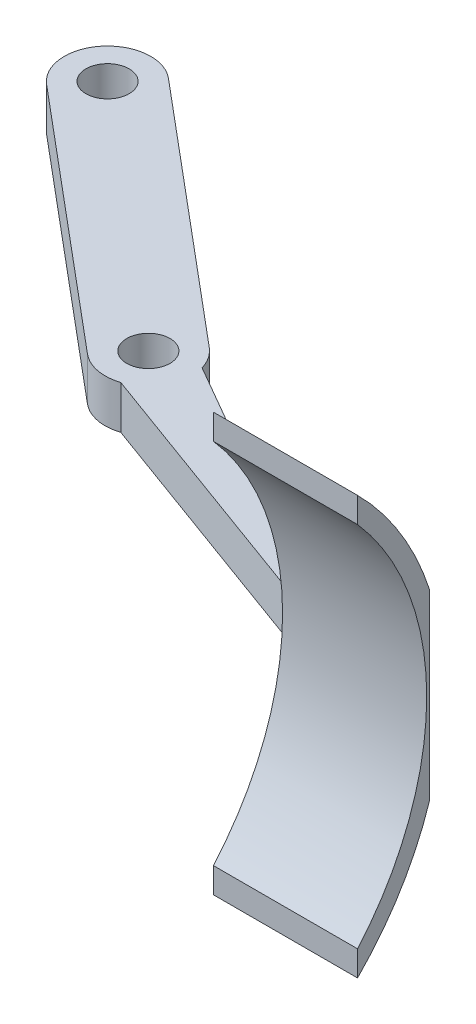
ISO-10303-21;
HEADER;
FILE_DESCRIPTION(('STEP AP214'),'2;1');
FILE_NAME('part.step','',(''),(''),'','','');
FILE_SCHEMA(('AUTOMOTIVE_DESIGN { 1 0 10303 214 1 1 1 1 }'));
ENDSEC;
DATA;
#1=APPLICATION_CONTEXT('core data for automotive mechanical design processes');
#2=APPLICATION_PROTOCOL_DEFINITION('international standard','automotive_design',2000,#1);
#3=PRODUCT_CONTEXT('',#1,'mechanical');
#4=PRODUCT('Part','Part','',(#3));
#5=PRODUCT_RELATED_PRODUCT_CATEGORY('part','',(#4));
#6=PRODUCT_DEFINITION_FORMATION('','',#4);
#7=PRODUCT_DEFINITION_CONTEXT('part definition',#1,'design');
#8=PRODUCT_DEFINITION('design','',#6,#7);
#9=PRODUCT_DEFINITION_SHAPE('','',#8);
#10=(LENGTH_UNIT() NAMED_UNIT(*) SI_UNIT(.MILLI.,.METRE.));
#11=(NAMED_UNIT(*) PLANE_ANGLE_UNIT() SI_UNIT($,.RADIAN.));
#12=(NAMED_UNIT(*) SI_UNIT($,.STERADIAN.) SOLID_ANGLE_UNIT());
#13=UNCERTAINTY_MEASURE_WITH_UNIT(LENGTH_MEASURE(1.E-05),#10,'distance_accuracy_value','');
#14=(GEOMETRIC_REPRESENTATION_CONTEXT(3) GLOBAL_UNCERTAINTY_ASSIGNED_CONTEXT((#13)) GLOBAL_UNIT_ASSIGNED_CONTEXT((#10,
#11,#12)) REPRESENTATION_CONTEXT('',''));
#15=CARTESIAN_POINT('',(0.,0.,0.));
#16=DIRECTION('',(0.,0.,1.));
#17=DIRECTION('',(1.,0.,0.));
#18=AXIS2_PLACEMENT_3D('',#15,#16,#17);
#19=CARTESIAN_POINT('',(0.,3.,0.));
#20=DIRECTION('',(0.,1.,0.));
#21=DIRECTION('',(0.,0.,1.));
#22=AXIS2_PLACEMENT_3D('',#19,#20,#21);
#23=PLANE('',#22);
#24=CARTESIAN_POINT('',(9.45858225453458,3.,-14.53916971558));
#25=DIRECTION('',(0.,1.,0.));
#26=DIRECTION('',(0.,0.,1.));
#27=AXIS2_PLACEMENT_3D('',#24,#25,#26);
#28=CIRCLE('',#27,1.5);
#29=CARTESIAN_POINT('',(9.45858225453458,3.,-13.03916971558));
#30=VERTEX_POINT('',#29);
#31=EDGE_CURVE('E331',#30,#30,#28,.T.);
#32=ORIENTED_EDGE('',*,*,#31,.F.);
#33=EDGE_LOOP('',(#32));
#34=FACE_BOUND('',#33,.T.);
#35=CARTESIAN_POINT('',(27.0776044462711,3.,0.244945307210359));
#36=DIRECTION('',(0.,1.,0.));
#37=DIRECTION('',(0.,0.,1.));
#38=AXIS2_PLACEMENT_3D('',#35,#36,#37);
#39=CIRCLE('',#38,1.5);
#40=CARTESIAN_POINT('',(27.0776044462711,3.,1.74494530721036));
#41=VERTEX_POINT('',#40);
#42=EDGE_CURVE('E340',#41,#41,#39,.T.);
#43=ORIENTED_EDGE('',*,*,#42,.F.);
#44=EDGE_LOOP('',(#43));
#45=FACE_BOUND('',#44,.T.);
#46=DIRECTION('',(0.866025403784442,0.,0.499999999999995));
#47=VECTOR('',#46,1.);
#48=CARTESIAN_POINT('',(26.5,3.,-2.59807621135332));
#49=LINE('',#48,#47);
#50=CARTESIAN_POINT('',(29.9552140227481,3.,-0.603207465211936));
#51=VERTEX_POINT('',#50);
#52=CARTESIAN_POINT('',(38.7529692626481,3.,4.47617889080871));
#53=VERTEX_POINT('',#52);
#54=EDGE_CURVE('E267',#51,#53,#49,.T.);
#55=ORIENTED_EDGE('',*,*,#54,.F.);
#56=CARTESIAN_POINT('',(27.0776044462711,3.,0.244945307210359));
#57=DIRECTION('',(0.,-1.,0.));
#58=DIRECTION('',(0.,0.,-1.));
#59=AXIS2_PLACEMENT_3D('',#56,#57,#58);
#60=CIRCLE('',#59,3.);
#61=CARTESIAN_POINT('',(29.0059672753307,3.,-2.05318802214658));
#62=VERTEX_POINT('',#61);
#63=EDGE_CURVE('E164',#62,#51,#60,.T.);
#64=ORIENTED_EDGE('',*,*,#63,.F.);
#65=DIRECTION('',(0.766044443118979,0.,0.642787609686538));
#66=VECTOR('',#65,1.);
#67=CARTESIAN_POINT('',(29.0059672753307,3.,-2.05318802214658));
#68=LINE('',#67,#66);
#69=CARTESIAN_POINT('',(11.3869450835942,3.,-16.8373030449369));
#70=VERTEX_POINT('',#69);
#71=EDGE_CURVE('E174',#70,#62,#68,.T.);
#72=ORIENTED_EDGE('',*,*,#71,.F.);
#73=CARTESIAN_POINT('',(9.45858225453458,3.,-14.53916971558));
#74=DIRECTION('',(0.,-1.,0.));
#75=DIRECTION('',(0.,0.,-1.));
#76=AXIS2_PLACEMENT_3D('',#73,#74,#75);
#77=CIRCLE('',#76,3.);
#78=CARTESIAN_POINT('',(7.53021942547497,3.,-12.2410363862231));
#79=VERTEX_POINT('',#78);
#80=EDGE_CURVE('E179',#79,#70,#77,.T.);
#81=ORIENTED_EDGE('',*,*,#80,.F.);
#82=DIRECTION('',(-0.766044443118979,0.,-0.642787609686538));
#83=VECTOR('',#82,1.);
#84=CARTESIAN_POINT('',(25.1492416172115,3.,2.54307863656729));
#85=LINE('',#84,#83);
#86=CARTESIAN_POINT('',(25.1492416172115,3.,2.54307863656729));
#87=VERTEX_POINT('',#86);
#88=EDGE_CURVE('E170',#87,#79,#85,.T.);
#89=ORIENTED_EDGE('',*,*,#88,.F.);
#90=CARTESIAN_POINT('',(28.0122150685353,3.,3.09564749873281));
#91=VERTEX_POINT('',#90);
#92=EDGE_CURVE('E155',#91,#87,#60,.T.);
#93=ORIENTED_EDGE('',*,*,#92,.F.);
#94=DIRECTION('',(-0.93937230919502,0.,-0.342898913263976));
#95=VECTOR('',#94,1.);
#96=CARTESIAN_POINT('',(26.9424392113373,3.,2.70514740065821));
#97=LINE('',#96,#95);
#98=CARTESIAN_POINT('',(46.0069306376765,3.,9.66425544337241));
#99=VERTEX_POINT('',#98);
#100=EDGE_CURVE('E265',#99,#91,#97,.T.);
#101=ORIENTED_EDGE('',*,*,#100,.F.);
#102=DIRECTION('',(0.,0.,1.));
#103=VECTOR('',#102,1.);
#104=CARTESIAN_POINT('',(46.0069306376764,3.,-3.19237210539256E-13));
#105=LINE('',#104,#103);
#106=CARTESIAN_POINT('',(46.0069306376765,3.,8.71915120486591));
#107=VERTEX_POINT('',#106);
#108=EDGE_CURVE('E262',#107,#99,#105,.T.);
#109=ORIENTED_EDGE('',*,*,#108,.F.);
#110=DIRECTION('',(1.,0.,0.));
#111=VECTOR('',#110,1.);
#112=CARTESIAN_POINT('',(46.0069306376765,3.,8.71915120486591));
#113=LINE('',#112,#111);
#114=CARTESIAN_POINT('',(55.0618263991699,3.,8.71915120486585));
#115=VERTEX_POINT('',#114);
#116=EDGE_CURVE('E257',#115,#107,#113,.F.);
#117=ORIENTED_EDGE('',*,*,#116,.F.);
#118=DIRECTION('',(0.707106781186551,0.,0.707106781186544));
#119=VECTOR('',#118,1.);
#120=CARTESIAN_POINT('',(23.1713375971518,3.,-23.171337597152));
#121=LINE('',#120,#119);
#122=CARTESIAN_POINT('',(53.0069306376764,3.,6.66425544337239));
#123=VERTEX_POINT('',#122);
#124=EDGE_CURVE('E46',#115,#123,#121,.F.);
#125=ORIENTED_EDGE('',*,*,#124,.T.);
#126=DIRECTION('',(1.,0.,0.));
#127=VECTOR('',#126,1.);
#128=CARTESIAN_POINT('',(50.8483883491102,3.,6.66425544337239));
#129=LINE('',#128,#127);
#130=CARTESIAN_POINT('',(45.0722670511086,3.,6.66425544337239));
#131=VERTEX_POINT('',#130);
#132=EDGE_CURVE('E208',#131,#123,#129,.T.);
#133=ORIENTED_EDGE('',*,*,#132,.F.);
#134=DIRECTION('',(-0.944957072862003,0.,-0.327194331320203));
#135=VECTOR('',#134,1.);
#136=CARTESIAN_POINT('',(38.7529692626481,3.,4.47617889080871));
#137=LINE('',#136,#135);
#138=EDGE_CURVE('E211',#131,#53,#137,.T.);
#139=ORIENTED_EDGE('',*,*,#138,.T.);
#140=EDGE_LOOP('',(#55,#64,#72,#81,#89,#93,#101,#109,#117,#125,#133,#139));
#141=FACE_BOUND('',#140,.T.);
#142=ADVANCED_FACE('F37',(#34,#45,#141),#23,.T.);
#143=CARTESIAN_POINT('',(0.,0.,0.));
#144=DIRECTION('',(0.,1.,0.));
#145=DIRECTION('',(0.,0.,1.));
#146=AXIS2_PLACEMENT_3D('',#143,#144,#145);
#147=PLANE('',#146);
#148=CARTESIAN_POINT('',(9.45858225453458,0.,-14.53916971558));
#149=DIRECTION('',(0.,1.,0.));
#150=DIRECTION('',(0.,0.,1.));
#151=AXIS2_PLACEMENT_3D('',#148,#149,#150);
#152=CIRCLE('',#151,1.5);
#153=CARTESIAN_POINT('',(9.45858225453458,0.,-13.03916971558));
#154=VERTEX_POINT('',#153);
#155=EDGE_CURVE('E329',#154,#154,#152,.T.);
#156=ORIENTED_EDGE('',*,*,#155,.T.);
#157=EDGE_LOOP('',(#156));
#158=FACE_BOUND('',#157,.T.);
#159=CARTESIAN_POINT('',(27.0776044462711,0.,0.244945307210359));
#160=DIRECTION('',(0.,1.,0.));
#161=DIRECTION('',(0.,0.,1.));
#162=AXIS2_PLACEMENT_3D('',#159,#160,#161);
#163=CIRCLE('',#162,1.5);
#164=CARTESIAN_POINT('',(27.0776044462711,0.,1.74494530721036));
#165=VERTEX_POINT('',#164);
#166=EDGE_CURVE('E336',#165,#165,#163,.T.);
#167=ORIENTED_EDGE('',*,*,#166,.T.);
#168=EDGE_LOOP('',(#167));
#169=FACE_BOUND('',#168,.T.);
#170=DIRECTION('',(-0.93937230919502,0.,-0.342898913263976));
#171=VECTOR('',#170,1.);
#172=CARTESIAN_POINT('',(26.9424392113373,0.,2.70514740065821));
#173=LINE('',#172,#171);
#174=CARTESIAN_POINT('',(46.0069306376765,0.,9.66425544337241));
#175=VERTEX_POINT('',#174);
#176=CARTESIAN_POINT('',(28.0122150685353,0.,3.09564749873281));
#177=VERTEX_POINT('',#176);
#178=EDGE_CURVE('E264',#175,#177,#173,.T.);
#179=ORIENTED_EDGE('',*,*,#178,.T.);
#180=CARTESIAN_POINT('',(27.0776044462711,0.,0.244945307210359));
#181=DIRECTION('',(0.,-1.,0.));
#182=DIRECTION('',(0.,0.,-1.));
#183=AXIS2_PLACEMENT_3D('',#180,#181,#182);
#184=CIRCLE('',#183,3.);
#185=CARTESIAN_POINT('',(25.1492416172115,0.,2.54307863656729));
#186=VERTEX_POINT('',#185);
#187=EDGE_CURVE('E190',#177,#186,#184,.T.);
#188=ORIENTED_EDGE('',*,*,#187,.T.);
#189=DIRECTION('',(-0.766044443118979,0.,-0.642787609686538));
#190=VECTOR('',#189,1.);
#191=CARTESIAN_POINT('',(25.1492416172115,0.,2.54307863656729));
#192=LINE('',#191,#190);
#193=CARTESIAN_POINT('',(7.53021942547497,0.,-12.2410363862231));
#194=VERTEX_POINT('',#193);
#195=EDGE_CURVE('E172',#186,#194,#192,.T.);
#196=ORIENTED_EDGE('',*,*,#195,.T.);
#197=CARTESIAN_POINT('',(9.45858225453458,0.,-14.53916971558));
#198=DIRECTION('',(0.,-1.,0.));
#199=DIRECTION('',(0.,0.,-1.));
#200=AXIS2_PLACEMENT_3D('',#197,#198,#199);
#201=CIRCLE('',#200,3.);
#202=CARTESIAN_POINT('',(11.3869450835942,0.,-16.8373030449369));
#203=VERTEX_POINT('',#202);
#204=EDGE_CURVE('E192',#194,#203,#201,.T.);
#205=ORIENTED_EDGE('',*,*,#204,.T.);
#206=DIRECTION('',(0.766044443118979,0.,0.642787609686538));
#207=VECTOR('',#206,1.);
#208=CARTESIAN_POINT('',(29.0059672753307,0.,-2.05318802214658));
#209=LINE('',#208,#207);
#210=CARTESIAN_POINT('',(29.0059672753307,0.,-2.05318802214658));
#211=VERTEX_POINT('',#210);
#212=EDGE_CURVE('E165',#203,#211,#209,.T.);
#213=ORIENTED_EDGE('',*,*,#212,.T.);
#214=CARTESIAN_POINT('',(29.9552140227481,0.,-0.603207465211936));
#215=VERTEX_POINT('',#214);
#216=EDGE_CURVE('E187',#211,#215,#184,.T.);
#217=ORIENTED_EDGE('',*,*,#216,.T.);
#218=DIRECTION('',(0.866025403784442,0.,0.499999999999995));
#219=VECTOR('',#218,1.);
#220=CARTESIAN_POINT('',(26.5,0.,-2.59807621135332));
#221=LINE('',#220,#219);
#222=CARTESIAN_POINT('',(38.7529692626481,0.,4.47617889080871));
#223=VERTEX_POINT('',#222);
#224=EDGE_CURVE('E53',#215,#223,#221,.T.);
#225=ORIENTED_EDGE('',*,*,#224,.T.);
#226=DIRECTION('',(-0.944957072862003,0.,-0.327194331320203));
#227=VECTOR('',#226,1.);
#228=CARTESIAN_POINT('',(38.7529692626481,0.,4.47617889080871));
#229=LINE('',#228,#227);
#230=CARTESIAN_POINT('',(45.0722670511086,0.,6.66425544337239));
#231=VERTEX_POINT('',#230);
#232=EDGE_CURVE('E212',#231,#223,#229,.T.);
#233=ORIENTED_EDGE('',*,*,#232,.F.);
#234=DIRECTION('',(-1.,0.,0.));
#235=VECTOR('',#234,1.);
#236=CARTESIAN_POINT('',(56.0069306376765,0.,6.66425544337239));
#237=LINE('',#236,#235);
#238=CARTESIAN_POINT('',(53.0069306376764,0.,6.66425544337239));
#239=VERTEX_POINT('',#238);
#240=EDGE_CURVE('E206',#239,#231,#237,.T.);
#241=ORIENTED_EDGE('',*,*,#240,.F.);
#242=DIRECTION('',(-0.707106781186551,0.,-0.707106781186544));
#243=VECTOR('',#242,1.);
#244=CARTESIAN_POINT('',(53.0069306376764,0.,6.66425544337239));
#245=LINE('',#244,#243);
#246=CARTESIAN_POINT('',(55.0618263991699,0.,8.71915120486585));
#247=VERTEX_POINT('',#246);
#248=EDGE_CURVE('E277',#239,#247,#245,.F.);
#249=ORIENTED_EDGE('',*,*,#248,.T.);
#250=DIRECTION('',(1.,0.,0.));
#251=VECTOR('',#250,1.);
#252=CARTESIAN_POINT('',(46.0069306376765,0.,8.71915120486591));
#253=LINE('',#252,#251);
#254=CARTESIAN_POINT('',(46.0069306376765,0.,8.71915120486591));
#255=VERTEX_POINT('',#254);
#256=EDGE_CURVE('E249',#247,#255,#253,.F.);
#257=ORIENTED_EDGE('',*,*,#256,.T.);
#258=DIRECTION('',(0.,0.,1.));
#259=VECTOR('',#258,1.);
#260=CARTESIAN_POINT('',(46.0069306376764,0.,-3.19237210539256E-13));
#261=LINE('',#260,#259);
#262=EDGE_CURVE('E259',#255,#175,#261,.T.);
#263=ORIENTED_EDGE('',*,*,#262,.T.);
#264=EDGE_LOOP('',(#179,#188,#196,#205,#213,#217,#225,#233,#241,#249,#257,#263));
#265=FACE_BOUND('',#264,.T.);
#266=ADVANCED_FACE('F299',(#158,#169,#265),#147,.F.);
#267=CARTESIAN_POINT('',(26.5,3.,-2.59807621135332));
#268=DIRECTION('',(0.499999999999995,0.,-0.866025403784441));
#269=DIRECTION('',(-0.866025403784442,0.,-0.499999999999995));
#270=AXIS2_PLACEMENT_3D('',#267,#268,#269);
#271=PLANE('',#270);
#272=DIRECTION('',(0.,-1.,0.));
#273=VECTOR('',#272,1.);
#274=CARTESIAN_POINT('',(29.9552140227481,3.,-0.603207465211935));
#275=LINE('',#274,#273);
#276=EDGE_CURVE('E57',#51,#215,#275,.T.);
#277=ORIENTED_EDGE('',*,*,#276,.F.);
#278=ORIENTED_EDGE('',*,*,#54,.T.);
#279=DIRECTION('',(0.,1.,0.));
#280=VECTOR('',#279,1.);
#281=CARTESIAN_POINT('',(38.7529692626481,0.,4.47617889080871));
#282=LINE('',#281,#280);
#283=EDGE_CURVE('E215',#223,#53,#282,.T.);
#284=ORIENTED_EDGE('',*,*,#283,.F.);
#285=ORIENTED_EDGE('',*,*,#224,.F.);
#286=EDGE_LOOP('',(#277,#278,#284,#285));
#287=FACE_BOUND('',#286,.T.);
#288=ADVANCED_FACE('F353',(#287),#271,.T.);
#289=CARTESIAN_POINT('',(26.9424392113373,3.,2.70514740065821));
#290=DIRECTION('',(-0.342898913263976,0.,0.93937230919502));
#291=DIRECTION('',(0.93937230919502,0.,0.342898913263976));
#292=AXIS2_PLACEMENT_3D('',#289,#290,#291);
#293=PLANE('',#292);
#294=DIRECTION('',(0.,-1.,0.));
#295=VECTOR('',#294,1.);
#296=CARTESIAN_POINT('',(28.0122150685353,3.,3.09564749873281));
#297=LINE('',#296,#295);
#298=EDGE_CURVE('E11',#177,#91,#297,.F.);
#299=ORIENTED_EDGE('',*,*,#298,.F.);
#300=ORIENTED_EDGE('',*,*,#178,.F.);
#301=DIRECTION('',(0.,-1.,0.));
#302=VECTOR('',#301,1.);
#303=CARTESIAN_POINT('',(46.0069306376765,3.,9.66425544337241));
#304=LINE('',#303,#302);
#305=EDGE_CURVE('E269',#99,#175,#304,.T.);
#306=ORIENTED_EDGE('',*,*,#305,.F.);
#307=ORIENTED_EDGE('',*,*,#100,.T.);
#308=EDGE_LOOP('',(#299,#300,#306,#307));
#309=FACE_BOUND('',#308,.T.);
#310=ADVANCED_FACE('F327',(#309),#293,.T.);
#311=CARTESIAN_POINT('',(56.0069306376765,3.,9.66425544337239));
#312=DIRECTION('',(1.,0.,0.));
#313=DIRECTION('',(0.,0.,-1.));
#314=AXIS2_PLACEMENT_3D('',#311,#312,#313);
#315=PLANE('',#314);
#316=CARTESIAN_POINT('',(56.0069306376766,1.5,29.1850887767055));
#317=DIRECTION('',(1.,0.,0.));
#318=DIRECTION('',(0.,0.,1.));
#319=AXIS2_PLACEMENT_3D('',#316,#317,#318);
#320=CIRCLE('',#319,20.5208333333332);
#321=CARTESIAN_POINT('',(56.0069306376765,-13.,14.6642554433724));
#322=VERTEX_POINT('',#321);
#323=CARTESIAN_POINT('',(56.0069306376765,-4.82784850219008,9.66425544337239));
#324=VERTEX_POINT('',#323);
#325=EDGE_CURVE('E235',#322,#324,#320,.T.);
#326=ORIENTED_EDGE('',*,*,#325,.T.);
#327=DIRECTION('',(0.,1.,0.));
#328=VECTOR('',#327,1.);
#329=CARTESIAN_POINT('',(56.0069306376765,3.,9.66425544337239));
#330=LINE('',#329,#328);
#331=CARTESIAN_POINT('',(56.0069306376765,7.82784850219008,9.66425544337239));
#332=VERTEX_POINT('',#331);
#333=EDGE_CURVE('E281',#324,#332,#330,.T.);
#334=ORIENTED_EDGE('',*,*,#333,.T.);
#335=CARTESIAN_POINT('',(56.0069306376765,16.,14.6642554433724));
#336=VERTEX_POINT('',#335);
#337=EDGE_CURVE('E220',#332,#336,#320,.T.);
#338=ORIENTED_EDGE('',*,*,#337,.T.);
#339=DIRECTION('',(0.,-1.,0.));
#340=VECTOR('',#339,1.);
#341=CARTESIAN_POINT('',(56.0069306376765,16.,14.6642554433724));
#342=LINE('',#341,#340);
#343=CARTESIAN_POINT('',(56.0069306376765,14.2451951730839,14.6642554433724));
#344=VERTEX_POINT('',#343);
#345=EDGE_CURVE('E238',#336,#344,#342,.T.);
#346=ORIENTED_EDGE('',*,*,#345,.T.);
#347=CARTESIAN_POINT('',(56.0069306376766,1.5,29.1850887767055));
#348=DIRECTION('',(-1.,0.,0.));
#349=DIRECTION('',(0.,0.,1.));
#350=AXIS2_PLACEMENT_3D('',#347,#348,#349);
#351=CIRCLE('',#350,19.3208333333332);
#352=CARTESIAN_POINT('',(56.0069306376765,-11.2451951730839,14.6642554433724));
#353=VERTEX_POINT('',#352);
#354=EDGE_CURVE('E241',#344,#353,#351,.T.);
#355=ORIENTED_EDGE('',*,*,#354,.T.);
#356=DIRECTION('',(0.,-1.,0.));
#357=VECTOR('',#356,1.);
#358=CARTESIAN_POINT('',(56.0069306376765,-11.2451951730839,14.6642554433724));
#359=LINE('',#358,#357);
#360=EDGE_CURVE('E244',#353,#322,#359,.T.);
#361=ORIENTED_EDGE('',*,*,#360,.T.);
#362=EDGE_LOOP('',(#326,#334,#338,#346,#355,#361));
#363=FACE_BOUND('',#362,.T.);
#364=ADVANCED_FACE('F356',(#363),#315,.T.);
#365=CARTESIAN_POINT('',(46.0069306376766,1.5,29.1850887767056));
#366=DIRECTION('',(1.,0.,0.));
#367=DIRECTION('',(0.,0.,-1.));
#368=AXIS2_PLACEMENT_3D('',#365,#366,#367);
#369=CYLINDRICAL_SURFACE('',#368,20.5208333333332);
#370=ORIENTED_EDGE('',*,*,#256,.F.);
#371=CARTESIAN_POINT('',(75.5277639710096,1.5,29.1850887767053));
#372=DIRECTION('',(-0.707106781186544,0.,0.707106781186551));
#373=DIRECTION('',(0.707106781186551,0.,0.707106781186544));
#374=AXIS2_PLACEMENT_3D('',#371,#372,#373);
#375=ELLIPSE('',#374,29.0208408111976,20.5208333333332);
#376=EDGE_CURVE('E279',#247,#324,#375,.T.);
#377=ORIENTED_EDGE('',*,*,#376,.T.);
#378=ORIENTED_EDGE('',*,*,#325,.F.);
#379=DIRECTION('',(1.,0.,0.));
#380=VECTOR('',#379,1.);
#381=CARTESIAN_POINT('',(46.0069306376765,-13.,14.6642554433725));
#382=LINE('',#381,#380);
#383=CARTESIAN_POINT('',(46.0069306376765,-13.,14.6642554433725));
#384=VERTEX_POINT('',#383);
#385=EDGE_CURVE('E247',#384,#322,#382,.T.);
#386=ORIENTED_EDGE('',*,*,#385,.F.);
#387=CARTESIAN_POINT('',(46.0069306376766,1.5,29.1850887767056));
#388=DIRECTION('',(1.,0.,0.));
#389=DIRECTION('',(0.,0.,1.));
#390=AXIS2_PLACEMENT_3D('',#387,#388,#389);
#391=CIRCLE('',#390,20.5208333333332);
#392=EDGE_CURVE('E221',#384,#255,#391,.T.);
#393=ORIENTED_EDGE('',*,*,#392,.T.);
#394=EDGE_LOOP('',(#370,#377,#378,#386,#393));
#395=FACE_BOUND('',#394,.T.);
#396=ADVANCED_FACE('F303',(#395),#369,.T.);
#397=ORIENTED_EDGE('',*,*,#337,.F.);
#398=CARTESIAN_POINT('',(75.5277639710096,1.5,29.1850887767053));
#399=DIRECTION('',(-0.707106781186544,0.,0.707106781186551));
#400=DIRECTION('',(0.707106781186551,0.,0.707106781186544));
#401=AXIS2_PLACEMENT_3D('',#398,#399,#400);
#402=ELLIPSE('',#401,29.0208408111976,20.5208333333332);
#403=EDGE_CURVE('E283',#332,#115,#402,.T.);
#404=ORIENTED_EDGE('',*,*,#403,.T.);
#405=ORIENTED_EDGE('',*,*,#116,.T.);
#406=CARTESIAN_POINT('',(46.0069306376765,16.,14.6642554433725));
#407=VERTEX_POINT('',#406);
#408=EDGE_CURVE('E225',#107,#407,#391,.T.);
#409=ORIENTED_EDGE('',*,*,#408,.T.);
#410=DIRECTION('',(1.,0.,0.));
#411=VECTOR('',#410,1.);
#412=CARTESIAN_POINT('',(46.0069306376765,16.,14.6642554433725));
#413=LINE('',#412,#411);
#414=EDGE_CURVE('E234',#407,#336,#413,.T.);
#415=ORIENTED_EDGE('',*,*,#414,.T.);
#416=EDGE_LOOP('',(#397,#404,#405,#409,#415));
#417=FACE_BOUND('',#416,.T.);
#418=ADVANCED_FACE('F324',(#417),#369,.T.);
#419=CARTESIAN_POINT('',(46.0069306376765,-11.2451951730839,14.6642554433725));
#420=DIRECTION('',(0.,0.,1.));
#421=DIRECTION('',(1.,0.,0.));
#422=AXIS2_PLACEMENT_3D('',#419,#420,#421);
#423=PLANE('',#422);
#424=ORIENTED_EDGE('',*,*,#360,.F.);
#425=DIRECTION('',(1.,0.,0.));
#426=VECTOR('',#425,1.);
#427=CARTESIAN_POINT('',(46.0069306376765,-11.2451951730839,14.6642554433725));
#428=LINE('',#427,#426);
#429=CARTESIAN_POINT('',(46.0069306376765,-11.2451951730839,14.6642554433725));
#430=VERTEX_POINT('',#429);
#431=EDGE_CURVE('E250',#430,#353,#428,.T.);
#432=ORIENTED_EDGE('',*,*,#431,.F.);
#433=DIRECTION('',(0.,-1.,0.));
#434=VECTOR('',#433,1.);
#435=CARTESIAN_POINT('',(46.0069306376765,-11.2451951730839,14.6642554433725));
#436=LINE('',#435,#434);
#437=EDGE_CURVE('E231',#430,#384,#436,.T.);
#438=ORIENTED_EDGE('',*,*,#437,.T.);
#439=ORIENTED_EDGE('',*,*,#385,.T.);
#440=EDGE_LOOP('',(#424,#432,#438,#439));
#441=FACE_BOUND('',#440,.T.);
#442=ADVANCED_FACE('F313',(#441),#423,.T.);
#443=CARTESIAN_POINT('',(46.0069306376766,1.5,29.1850887767056));
#444=DIRECTION('',(1.,0.,0.));
#445=DIRECTION('',(0.,0.,-1.));
#446=AXIS2_PLACEMENT_3D('',#443,#444,#445);
#447=CYLINDRICAL_SURFACE('',#446,19.3208333333332);
#448=ORIENTED_EDGE('',*,*,#354,.F.);
#449=DIRECTION('',(1.,0.,0.));
#450=VECTOR('',#449,1.);
#451=CARTESIAN_POINT('',(46.0069306376765,14.2451951730839,14.6642554433725));
#452=LINE('',#451,#450);
#453=CARTESIAN_POINT('',(46.0069306376765,14.2451951730839,14.6642554433725));
#454=VERTEX_POINT('',#453);
#455=EDGE_CURVE('E252',#454,#344,#452,.T.);
#456=ORIENTED_EDGE('',*,*,#455,.F.);
#457=CARTESIAN_POINT('',(46.0069306376766,1.5,29.1850887767056));
#458=DIRECTION('',(-1.,0.,0.));
#459=DIRECTION('',(0.,0.,1.));
#460=AXIS2_PLACEMENT_3D('',#457,#458,#459);
#461=CIRCLE('',#460,19.3208333333332);
#462=EDGE_CURVE('E228',#454,#430,#461,.T.);
#463=ORIENTED_EDGE('',*,*,#462,.T.);
#464=ORIENTED_EDGE('',*,*,#431,.T.);
#465=EDGE_LOOP('',(#448,#456,#463,#464));
#466=FACE_BOUND('',#465,.T.);
#467=ADVANCED_FACE('F316',(#466),#447,.F.);
#468=CARTESIAN_POINT('',(46.0069306376765,16.,14.6642554433725));
#469=DIRECTION('',(0.,0.,1.));
#470=DIRECTION('',(1.,0.,0.));
#471=AXIS2_PLACEMENT_3D('',#468,#469,#470);
#472=PLANE('',#471);
#473=ORIENTED_EDGE('',*,*,#345,.F.);
#474=ORIENTED_EDGE('',*,*,#414,.F.);
#475=DIRECTION('',(0.,-1.,0.));
#476=VECTOR('',#475,1.);
#477=CARTESIAN_POINT('',(46.0069306376765,16.,14.6642554433725));
#478=LINE('',#477,#476);
#479=EDGE_CURVE('E224',#407,#454,#478,.T.);
#480=ORIENTED_EDGE('',*,*,#479,.T.);
#481=ORIENTED_EDGE('',*,*,#455,.T.);
#482=EDGE_LOOP('',(#473,#474,#480,#481));
#483=FACE_BOUND('',#482,.T.);
#484=ADVANCED_FACE('F321',(#483),#472,.T.);
#485=CARTESIAN_POINT('',(46.0069306376766,1.5,29.1850887767056));
#486=DIRECTION('',(-1.,0.,0.));
#487=DIRECTION('',(0.,0.,1.));
#488=AXIS2_PLACEMENT_3D('',#485,#486,#487);
#489=PLANE('',#488);
#490=ORIENTED_EDGE('',*,*,#408,.F.);
#491=ORIENTED_EDGE('',*,*,#108,.T.);
#492=ORIENTED_EDGE('',*,*,#305,.T.);
#493=ORIENTED_EDGE('',*,*,#262,.F.);
#494=ORIENTED_EDGE('',*,*,#392,.F.);
#495=ORIENTED_EDGE('',*,*,#437,.F.);
#496=ORIENTED_EDGE('',*,*,#462,.F.);
#497=ORIENTED_EDGE('',*,*,#479,.F.);
#498=EDGE_LOOP('',(#490,#491,#492,#493,#494,#495,#496,#497));
#499=FACE_BOUND('',#498,.T.);
#500=ADVANCED_FACE('F309',(#499),#489,.T.);
#501=CARTESIAN_POINT('',(38.7529692626481,0.,4.47617889080871));
#502=DIRECTION('',(0.327194331320203,0.,-0.944957072862003));
#503=DIRECTION('',(-0.944957072862003,0.,-0.327194331320203));
#504=AXIS2_PLACEMENT_3D('',#501,#502,#503);
#505=PLANE('',#504);
#506=DIRECTION('',(0.,1.,0.));
#507=VECTOR('',#506,1.);
#508=CARTESIAN_POINT('',(45.0722670511086,0.,6.66425544337239));
#509=LINE('',#508,#507);
#510=EDGE_CURVE('E203',#231,#131,#509,.T.);
#511=ORIENTED_EDGE('',*,*,#510,.F.);
#512=ORIENTED_EDGE('',*,*,#232,.T.);
#513=ORIENTED_EDGE('',*,*,#283,.T.);
#514=ORIENTED_EDGE('',*,*,#138,.F.);
#515=EDGE_LOOP('',(#511,#512,#513,#514));
#516=FACE_BOUND('',#515,.T.);
#517=ADVANCED_FACE('F374',(#516),#505,.T.);
#518=CARTESIAN_POINT('',(0.,0.,6.66425544337239));
#519=DIRECTION('',(0.,0.,-1.));
#520=DIRECTION('',(-1.,0.,0.));
#521=AXIS2_PLACEMENT_3D('',#518,#519,#520);
#522=PLANE('',#521);
#523=ORIENTED_EDGE('',*,*,#132,.T.);
#524=DIRECTION('',(0.,-1.,0.));
#525=VECTOR('',#524,1.);
#526=CARTESIAN_POINT('',(53.0069306376764,0.,6.66425544337239));
#527=LINE('',#526,#525);
#528=EDGE_CURVE('E274',#123,#239,#527,.T.);
#529=ORIENTED_EDGE('',*,*,#528,.T.);
#530=ORIENTED_EDGE('',*,*,#240,.T.);
#531=ORIENTED_EDGE('',*,*,#510,.T.);
#532=EDGE_LOOP('',(#523,#529,#530,#531));
#533=FACE_BOUND('',#532,.T.);
#534=ADVANCED_FACE('F291',(#533),#522,.T.);
#535=CARTESIAN_POINT('',(53.0069306376764,0.,6.66425544337239));
#536=DIRECTION('',(-0.707106781186544,0.,0.707106781186551));
#537=DIRECTION('',(0.,-1.,0.));
#538=AXIS2_PLACEMENT_3D('',#535,#536,#537);
#539=PLANE('',#538);
#540=ORIENTED_EDGE('',*,*,#403,.F.);
#541=ORIENTED_EDGE('',*,*,#333,.F.);
#542=ORIENTED_EDGE('',*,*,#376,.F.);
#543=ORIENTED_EDGE('',*,*,#248,.F.);
#544=ORIENTED_EDGE('',*,*,#528,.F.);
#545=ORIENTED_EDGE('',*,*,#124,.F.);
#546=EDGE_LOOP('',(#540,#541,#542,#543,#544,#545));
#547=FACE_BOUND('',#546,.T.);
#548=ADVANCED_FACE('F40',(#547),#539,.F.);
#549=CARTESIAN_POINT('',(27.0776044462711,3.,0.244945307210359));
#550=DIRECTION('',(0.,-1.,0.));
#551=DIRECTION('',(0.,0.,-1.));
#552=AXIS2_PLACEMENT_3D('',#549,#550,#551);
#553=CYLINDRICAL_SURFACE('',#552,3.);
#554=ORIENTED_EDGE('',*,*,#63,.T.);
#555=ORIENTED_EDGE('',*,*,#276,.T.);
#556=ORIENTED_EDGE('',*,*,#216,.F.);
#557=DIRECTION('',(0.,-1.,0.));
#558=VECTOR('',#557,1.);
#559=CARTESIAN_POINT('',(29.0059672753307,3.,-2.05318802214658));
#560=LINE('',#559,#558);
#561=EDGE_CURVE('E197',#62,#211,#560,.T.);
#562=ORIENTED_EDGE('',*,*,#561,.F.);
#563=EDGE_LOOP('',(#554,#555,#556,#562));
#564=FACE_BOUND('',#563,.T.);
#565=ADVANCED_FACE('F383',(#564),#553,.T.);
#566=ORIENTED_EDGE('',*,*,#187,.F.);
#567=ORIENTED_EDGE('',*,*,#298,.T.);
#568=ORIENTED_EDGE('',*,*,#92,.T.);
#569=DIRECTION('',(0.,-1.,0.));
#570=VECTOR('',#569,1.);
#571=CARTESIAN_POINT('',(25.1492416172115,3.,2.54307863656729));
#572=LINE('',#571,#570);
#573=EDGE_CURVE('E159',#87,#186,#572,.T.);
#574=ORIENTED_EDGE('',*,*,#573,.T.);
#575=EDGE_LOOP('',(#566,#567,#568,#574));
#576=FACE_BOUND('',#575,.T.);
#577=ADVANCED_FACE('F158',(#576),#553,.T.);
#578=CARTESIAN_POINT('',(29.0059672753307,3.,-2.05318802214658));
#579=DIRECTION('',(0.642787609686538,0.,-0.766044443118979));
#580=DIRECTION('',(-0.766044443118979,0.,-0.642787609686538));
#581=AXIS2_PLACEMENT_3D('',#578,#579,#580);
#582=PLANE('',#581);
#583=ORIENTED_EDGE('',*,*,#212,.F.);
#584=DIRECTION('',(0.,-1.,0.));
#585=VECTOR('',#584,1.);
#586=CARTESIAN_POINT('',(11.3869450835942,3.,-16.8373030449369));
#587=LINE('',#586,#585);
#588=EDGE_CURVE('E199',#70,#203,#587,.T.);
#589=ORIENTED_EDGE('',*,*,#588,.F.);
#590=ORIENTED_EDGE('',*,*,#71,.T.);
#591=ORIENTED_EDGE('',*,*,#561,.T.);
#592=EDGE_LOOP('',(#583,#589,#590,#591));
#593=FACE_BOUND('',#592,.T.);
#594=ADVANCED_FACE('F382',(#593),#582,.T.);
#595=CARTESIAN_POINT('',(9.45858225453458,3.,-14.53916971558));
#596=DIRECTION('',(0.,-1.,0.));
#597=DIRECTION('',(0.,0.,-1.));
#598=AXIS2_PLACEMENT_3D('',#595,#596,#597);
#599=CYLINDRICAL_SURFACE('',#598,3.);
#600=ORIENTED_EDGE('',*,*,#204,.F.);
#601=DIRECTION('',(0.,-1.,0.));
#602=VECTOR('',#601,1.);
#603=CARTESIAN_POINT('',(7.53021942547497,3.,-12.2410363862231));
#604=LINE('',#603,#602);
#605=EDGE_CURVE('E173',#79,#194,#604,.T.);
#606=ORIENTED_EDGE('',*,*,#605,.F.);
#607=ORIENTED_EDGE('',*,*,#80,.T.);
#608=ORIENTED_EDGE('',*,*,#588,.T.);
#609=EDGE_LOOP('',(#600,#606,#607,#608));
#610=FACE_BOUND('',#609,.T.);
#611=ADVANCED_FACE('F386',(#610),#599,.T.);
#612=CARTESIAN_POINT('',(25.1492416172115,3.,2.54307863656729));
#613=DIRECTION('',(-0.642787609686538,0.,0.766044443118979));
#614=DIRECTION('',(0.766044443118979,0.,0.642787609686538));
#615=AXIS2_PLACEMENT_3D('',#612,#613,#614);
#616=PLANE('',#615);
#617=ORIENTED_EDGE('',*,*,#195,.F.);
#618=ORIENTED_EDGE('',*,*,#573,.F.);
#619=ORIENTED_EDGE('',*,*,#88,.T.);
#620=ORIENTED_EDGE('',*,*,#605,.T.);
#621=EDGE_LOOP('',(#617,#618,#619,#620));
#622=FACE_BOUND('',#621,.T.);
#623=ADVANCED_FACE('F169',(#622),#616,.T.);
#624=CARTESIAN_POINT('',(27.0776044462711,0.,0.244945307210359));
#625=DIRECTION('',(0.,1.,0.));
#626=DIRECTION('',(0.,0.,1.));
#627=AXIS2_PLACEMENT_3D('',#624,#625,#626);
#628=CYLINDRICAL_SURFACE('',#627,1.5);
#629=ORIENTED_EDGE('',*,*,#166,.F.);
#630=EDGE_LOOP('',(#629));
#631=FACE_BOUND('',#630,.T.);
#632=ORIENTED_EDGE('',*,*,#42,.T.);
#633=EDGE_LOOP('',(#632));
#634=FACE_BOUND('',#633,.T.);
#635=ADVANCED_FACE('F344',(#631,#634),#628,.F.);
#636=CARTESIAN_POINT('',(9.45858225453458,0.,-14.53916971558));
#637=DIRECTION('',(0.,1.,0.));
#638=DIRECTION('',(0.,0.,1.));
#639=AXIS2_PLACEMENT_3D('',#636,#637,#638);
#640=CYLINDRICAL_SURFACE('',#639,1.5);
#641=ORIENTED_EDGE('',*,*,#155,.F.);
#642=EDGE_LOOP('',(#641));
#643=FACE_BOUND('',#642,.T.);
#644=ORIENTED_EDGE('',*,*,#31,.T.);
#645=EDGE_LOOP('',(#644));
#646=FACE_BOUND('',#645,.T.);
#647=ADVANCED_FACE('F395',(#643,#646),#640,.F.);
#648=CLOSED_SHELL('',(#142,#266,#288,#310,#364,#396,#418,#442,#467,#484,#500,#517,#534,#548,
#565,#577,#594,#611,#623,#635,#647));
#649=MANIFOLD_SOLID_BREP('B2',#648);
#650=ADVANCED_BREP_SHAPE_REPRESENTATION('',(#18,#649),#14);
#651=SHAPE_DEFINITION_REPRESENTATION(#9,#650);
ENDSEC;
END-ISO-10303-21;
